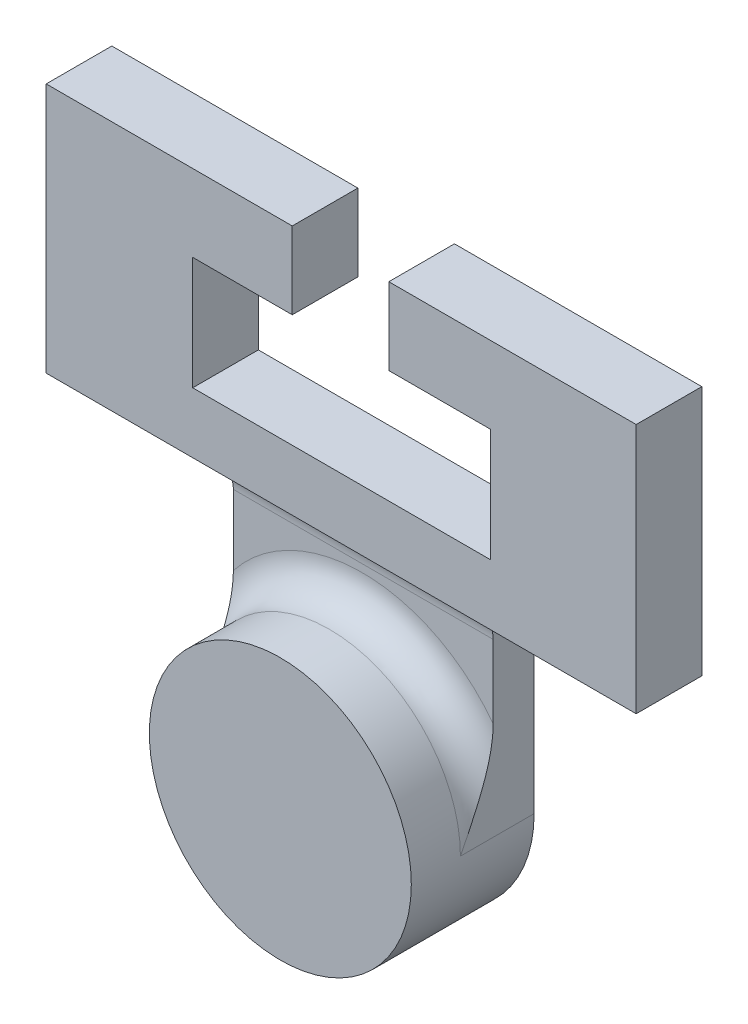
ISO-10303-21;
HEADER;
FILE_DESCRIPTION(('STEP AP214'),'2;1');
FILE_NAME('part.step','',(''),(''),'','','');
FILE_SCHEMA(('AUTOMOTIVE_DESIGN { 1 0 10303 214 1 1 1 1 }'));
ENDSEC;
DATA;
#1=APPLICATION_CONTEXT('core data for automotive mechanical design processes');
#2=APPLICATION_PROTOCOL_DEFINITION('international standard','automotive_design',2000,#1);
#3=PRODUCT_CONTEXT('',#1,'mechanical');
#4=PRODUCT('Part','Part','',(#3));
#5=PRODUCT_RELATED_PRODUCT_CATEGORY('part','',(#4));
#6=PRODUCT_DEFINITION_FORMATION('','',#4);
#7=PRODUCT_DEFINITION_CONTEXT('part definition',#1,'design');
#8=PRODUCT_DEFINITION('design','',#6,#7);
#9=PRODUCT_DEFINITION_SHAPE('','',#8);
#10=(LENGTH_UNIT() NAMED_UNIT(*) SI_UNIT(.MILLI.,.METRE.));
#11=(NAMED_UNIT(*) PLANE_ANGLE_UNIT() SI_UNIT($,.RADIAN.));
#12=(NAMED_UNIT(*) SI_UNIT($,.STERADIAN.) SOLID_ANGLE_UNIT());
#13=UNCERTAINTY_MEASURE_WITH_UNIT(LENGTH_MEASURE(1.E-05),#10,'distance_accuracy_value','');
#14=(GEOMETRIC_REPRESENTATION_CONTEXT(3) GLOBAL_UNCERTAINTY_ASSIGNED_CONTEXT((#13)) GLOBAL_UNIT_ASSIGNED_CONTEXT((#10,
#11,#12)) REPRESENTATION_CONTEXT('',''));
#15=CARTESIAN_POINT('',(0.,0.,0.));
#16=DIRECTION('',(0.,0.,1.));
#17=DIRECTION('',(1.,0.,0.));
#18=AXIS2_PLACEMENT_3D('',#15,#16,#17);
#19=CARTESIAN_POINT('',(0.,15.7544963007669,0.));
#20=DIRECTION('',(0.,1.,0.));
#21=DIRECTION('',(0.,0.,1.));
#22=AXIS2_PLACEMENT_3D('',#19,#20,#21);
#23=PLANE('',#22);
#24=DIRECTION('',(1.,0.,0.));
#25=VECTOR('',#24,1.);
#26=CARTESIAN_POINT('',(-22.5940298544979,15.7544963007669,-4.4350592362056));
#27=LINE('',#26,#25);
#28=CARTESIAN_POINT('',(10.16,15.7544963007669,-4.4350592362056));
#29=VERTEX_POINT('',#28);
#30=CARTESIAN_POINT('',(23.1661170587528,15.7544963007669,-4.4350592362056));
#31=VERTEX_POINT('',#30);
#32=EDGE_CURVE('E315',#29,#31,#27,.T.);
#33=ORIENTED_EDGE('',*,*,#32,.F.);
#34=DIRECTION('',(0.,0.,-1.));
#35=VECTOR('',#34,1.);
#36=CARTESIAN_POINT('',(10.16,15.7544963007669,-6.35));
#37=LINE('',#36,#35);
#38=CARTESIAN_POINT('',(10.16,15.7544963007669,-9.525));
#39=VERTEX_POINT('',#38);
#40=EDGE_CURVE('E276',#29,#39,#37,.T.);
#41=ORIENTED_EDGE('',*,*,#40,.T.);
#42=DIRECTION('',(-1.,0.,0.));
#43=VECTOR('',#42,1.);
#44=CARTESIAN_POINT('',(-9.99152441464391,15.7544963007669,-9.525));
#45=LINE('',#44,#43);
#46=CARTESIAN_POINT('',(23.1661170587528,15.7544963007669,-9.525));
#47=VERTEX_POINT('',#46);
#48=EDGE_CURVE('E335',#47,#39,#45,.T.);
#49=ORIENTED_EDGE('',*,*,#48,.F.);
#50=DIRECTION('',(0.,0.,-1.));
#51=VECTOR('',#50,1.);
#52=CARTESIAN_POINT('',(23.1661170587528,15.7544963007669,-4.4350592362056));
#53=LINE('',#52,#51);
#54=EDGE_CURVE('E309',#31,#47,#53,.T.);
#55=ORIENTED_EDGE('',*,*,#54,.F.);
#56=EDGE_LOOP('',(#33,#41,#49,#55));
#57=FACE_BOUND('',#56,.T.);
#58=ADVANCED_FACE('F49',(#57),#23,.F.);
#59=CARTESIAN_POINT('',(0.,0.,-9.525));
#60=DIRECTION('',(0.,0.,1.));
#61=DIRECTION('',(1.,0.,0.));
#62=AXIS2_PLACEMENT_3D('',#59,#60,#61);
#63=CYLINDRICAL_SURFACE('',#62,10.16);
#64=DIRECTION('',(0.,0.,-1.));
#65=VECTOR('',#64,1.);
#66=CARTESIAN_POINT('',(10.16,0.,-6.35));
#67=LINE('',#66,#65);
#68=CARTESIAN_POINT('',(10.16,0.,-3.81));
#69=VERTEX_POINT('',#68);
#70=CARTESIAN_POINT('',(10.16,0.,-9.525));
#71=VERTEX_POINT('',#70);
#72=EDGE_CURVE('E266',#69,#71,#67,.T.);
#73=ORIENTED_EDGE('',*,*,#72,.F.);
#74=CARTESIAN_POINT('',(0.,0.,-3.81));
#75=DIRECTION('',(0.,0.,1.));
#76=DIRECTION('',(1.,0.,0.));
#77=AXIS2_PLACEMENT_3D('',#74,#75,#76);
#78=CIRCLE('',#77,10.16);
#79=CARTESIAN_POINT('',(-9.99152441464391,1.84256339689434,-3.81));
#80=VERTEX_POINT('',#79);
#81=EDGE_CURVE('E451',#69,#80,#78,.T.);
#82=ORIENTED_EDGE('',*,*,#81,.T.);
#83=DIRECTION('',(0.,0.,1.));
#84=VECTOR('',#83,1.);
#85=CARTESIAN_POINT('',(-9.99152441464391,1.84256339689434,-9.525));
#86=LINE('',#85,#84);
#87=CARTESIAN_POINT('',(-9.99152441464391,1.84256339689432,-9.525));
#88=VERTEX_POINT('',#87);
#89=EDGE_CURVE('E281',#88,#80,#86,.T.);
#90=ORIENTED_EDGE('',*,*,#89,.F.);
#91=CARTESIAN_POINT('',(0.,0.,-9.525));
#92=DIRECTION('',(0.,0.,1.));
#93=DIRECTION('',(1.,0.,0.));
#94=AXIS2_PLACEMENT_3D('',#91,#92,#93);
#95=CIRCLE('',#94,10.16);
#96=EDGE_CURVE('E294',#88,#71,#95,.T.);
#97=ORIENTED_EDGE('',*,*,#96,.T.);
#98=EDGE_LOOP('',(#73,#82,#90,#97));
#99=FACE_BOUND('',#98,.T.);
#100=CARTESIAN_POINT('',(0.,0.,0.));
#101=DIRECTION('',(0.,0.,1.));
#102=DIRECTION('',(1.,0.,0.));
#103=AXIS2_PLACEMENT_3D('',#100,#101,#102);
#104=CIRCLE('',#103,10.16);
#105=CARTESIAN_POINT('',(10.16,0.,0.));
#106=VERTEX_POINT('',#105);
#107=EDGE_CURVE('E291',#106,#106,#104,.T.);
#108=ORIENTED_EDGE('',*,*,#107,.F.);
#109=EDGE_LOOP('',(#108));
#110=FACE_BOUND('',#109,.T.);
#111=ADVANCED_FACE('F434',(#99,#110),#63,.T.);
#112=CARTESIAN_POINT('',(0.,0.,-9.525));
#113=DIRECTION('',(0.,0.,1.));
#114=DIRECTION('',(1.,0.,0.));
#115=AXIS2_PLACEMENT_3D('',#112,#113,#114);
#116=PLANE('',#115);
#117=ORIENTED_EDGE('',*,*,#96,.F.);
#118=DIRECTION('',(0.,1.,0.));
#119=VECTOR('',#118,1.);
#120=CARTESIAN_POINT('',(-9.99152441464391,0.,-9.525));
#121=LINE('',#120,#119);
#122=CARTESIAN_POINT('',(-9.99152441464391,15.7544963007669,-9.525));
#123=VERTEX_POINT('',#122);
#124=EDGE_CURVE('E277',#88,#123,#121,.T.);
#125=ORIENTED_EDGE('',*,*,#124,.T.);
#126=CARTESIAN_POINT('',(-22.5940298544979,15.7544963007669,-9.525));
#127=VERTEX_POINT('',#126);
#128=EDGE_CURVE('E329',#123,#127,#45,.T.);
#129=ORIENTED_EDGE('',*,*,#128,.T.);
#130=DIRECTION('',(0.,-1.,0.));
#131=VECTOR('',#130,1.);
#132=CARTESIAN_POINT('',(-22.5940298544979,20.4534963007669,-9.525));
#133=LINE('',#132,#131);
#134=CARTESIAN_POINT('',(-22.5940298544979,35.1854963007669,-9.525));
#135=VERTEX_POINT('',#134);
#136=EDGE_CURVE('E186',#135,#127,#133,.T.);
#137=ORIENTED_EDGE('',*,*,#136,.F.);
#138=DIRECTION('',(-1.,0.,0.));
#139=VECTOR('',#138,1.);
#140=CARTESIAN_POINT('',(-22.5940298544979,35.1854963007669,-9.525));
#141=LINE('',#140,#139);
#142=CARTESIAN_POINT('',(-3.51021879319782,35.1854963007669,-9.525));
#143=VERTEX_POINT('',#142);
#144=EDGE_CURVE('E204',#143,#135,#141,.T.);
#145=ORIENTED_EDGE('',*,*,#144,.F.);
#146=DIRECTION('',(0.,-1.,0.));
#147=VECTOR('',#146,1.);
#148=CARTESIAN_POINT('',(-3.51021879319782,35.1854963007669,-9.525));
#149=LINE('',#148,#147);
#150=CARTESIAN_POINT('',(-3.51021879319782,29.2164963007669,-9.525));
#151=VERTEX_POINT('',#150);
#152=EDGE_CURVE('E220',#143,#151,#149,.T.);
#153=ORIENTED_EDGE('',*,*,#152,.T.);
#154=DIRECTION('',(-1.,0.,0.));
#155=VECTOR('',#154,1.);
#156=CARTESIAN_POINT('',(-22.5940298544979,29.2164963007669,-9.525));
#157=LINE('',#156,#155);
#158=CARTESIAN_POINT('',(-11.2292856636925,29.2164963007669,-9.525));
#159=VERTEX_POINT('',#158);
#160=EDGE_CURVE('E206',#151,#159,#157,.T.);
#161=ORIENTED_EDGE('',*,*,#160,.T.);
#162=DIRECTION('',(0.,-1.,0.));
#163=VECTOR('',#162,1.);
#164=CARTESIAN_POINT('',(-11.2292856636925,29.2164963007669,-9.525));
#165=LINE('',#164,#163);
#166=CARTESIAN_POINT('',(-11.2292856636925,20.4534963007669,-9.525));
#167=VERTEX_POINT('',#166);
#168=EDGE_CURVE('E362',#159,#167,#165,.T.);
#169=ORIENTED_EDGE('',*,*,#168,.T.);
#170=DIRECTION('',(-1.,0.,0.));
#171=VECTOR('',#170,1.);
#172=CARTESIAN_POINT('',(23.1661170587528,20.4534963007669,-9.525));
#173=LINE('',#172,#171);
#174=CARTESIAN_POINT('',(11.8519896998851,20.4534963007669,-9.525));
#175=VERTEX_POINT('',#174);
#176=EDGE_CURVE('E320',#175,#167,#173,.T.);
#177=ORIENTED_EDGE('',*,*,#176,.F.);
#178=DIRECTION('',(0.,-1.,0.));
#179=VECTOR('',#178,1.);
#180=CARTESIAN_POINT('',(11.8519896998851,29.2164963007669,-9.525));
#181=LINE('',#180,#179);
#182=CARTESIAN_POINT('',(11.8519896998851,29.2164963007669,-9.525));
#183=VERTEX_POINT('',#182);
#184=EDGE_CURVE('E229',#183,#175,#181,.T.);
#185=ORIENTED_EDGE('',*,*,#184,.F.);
#186=DIRECTION('',(-1.,0.,0.));
#187=VECTOR('',#186,1.);
#188=CARTESIAN_POINT('',(23.1661170587528,29.2164963007669,-9.525));
#189=LINE('',#188,#187);
#190=CARTESIAN_POINT('',(3.98107233357738,29.2164963007669,-9.525));
#191=VERTEX_POINT('',#190);
#192=EDGE_CURVE('E222',#183,#191,#189,.T.);
#193=ORIENTED_EDGE('',*,*,#192,.T.);
#194=DIRECTION('',(0.,-1.,0.));
#195=VECTOR('',#194,1.);
#196=CARTESIAN_POINT('',(3.98107233357738,35.1854963007669,-9.525));
#197=LINE('',#196,#195);
#198=CARTESIAN_POINT('',(3.98107233357738,35.1854963007669,-9.525));
#199=VERTEX_POINT('',#198);
#200=EDGE_CURVE('E227',#199,#191,#197,.T.);
#201=ORIENTED_EDGE('',*,*,#200,.F.);
#202=DIRECTION('',(-1.,0.,0.));
#203=VECTOR('',#202,1.);
#204=CARTESIAN_POINT('',(23.1661170587528,35.1854963007669,-9.525));
#205=LINE('',#204,#203);
#206=CARTESIAN_POINT('',(23.1661170587528,35.1854963007669,-9.525));
#207=VERTEX_POINT('',#206);
#208=EDGE_CURVE('E374',#207,#199,#205,.T.);
#209=ORIENTED_EDGE('',*,*,#208,.F.);
#210=DIRECTION('',(0.,-1.,0.));
#211=VECTOR('',#210,1.);
#212=CARTESIAN_POINT('',(23.1661170587528,20.4534963007669,-9.525));
#213=LINE('',#212,#211);
#214=EDGE_CURVE('E318',#207,#47,#213,.T.);
#215=ORIENTED_EDGE('',*,*,#214,.T.);
#216=ORIENTED_EDGE('',*,*,#48,.T.);
#217=DIRECTION('',(0.,-1.,0.));
#218=VECTOR('',#217,1.);
#219=CARTESIAN_POINT('',(10.16,0.,-9.525));
#220=LINE('',#219,#218);
#221=EDGE_CURVE('E267',#39,#71,#220,.T.);
#222=ORIENTED_EDGE('',*,*,#221,.T.);
#223=EDGE_LOOP('',(#117,#125,#129,#137,#145,#153,#161,#169,#177,#185,#193,#201,#209,#215,#216,#222));
#224=FACE_BOUND('',#223,.T.);
#225=ADVANCED_FACE('F435',(#224),#116,.F.);
#226=CARTESIAN_POINT('',(0.,0.,0.));
#227=DIRECTION('',(0.,0.,1.));
#228=DIRECTION('',(1.,0.,0.));
#229=AXIS2_PLACEMENT_3D('',#226,#227,#228);
#230=PLANE('',#229);
#231=ORIENTED_EDGE('',*,*,#107,.T.);
#232=EDGE_LOOP('',(#231));
#233=FACE_BOUND('',#232,.T.);
#234=ADVANCED_FACE('F431',(#233),#230,.T.);
#235=CARTESIAN_POINT('',(10.16,0.,-6.35));
#236=DIRECTION('',(1.,0.,0.));
#237=DIRECTION('',(0.,0.,-1.));
#238=AXIS2_PLACEMENT_3D('',#235,#236,#237);
#239=PLANE('',#238);
#240=ORIENTED_EDGE('',*,*,#221,.F.);
#241=ORIENTED_EDGE('',*,*,#40,.F.);
#242=CARTESIAN_POINT('',(10.16,13.2926065893391,-3.81));
#243=DIRECTION('',(1.,0.,0.));
#244=DIRECTION('',(0.,0.,-1.));
#245=AXIS2_PLACEMENT_3D('',#242,#243,#244);
#246=CIRCLE('',#245,2.54);
#247=CARTESIAN_POINT('',(10.16,13.2926065893391,-6.35));
#248=VERTEX_POINT('',#247);
#249=EDGE_CURVE('E56',#29,#248,#246,.F.);
#250=ORIENTED_EDGE('',*,*,#249,.T.);
#251=DIRECTION('',(0.,-1.,0.));
#252=VECTOR('',#251,1.);
#253=CARTESIAN_POINT('',(10.16,0.,-6.35));
#254=LINE('',#253,#252);
#255=CARTESIAN_POINT('',(10.16,7.62,-6.35));
#256=VERTEX_POINT('',#255);
#257=EDGE_CURVE('E270',#248,#256,#254,.T.);
#258=ORIENTED_EDGE('',*,*,#257,.T.);
#259=CARTESIAN_POINT('',(10.16,7.62,-6.35));
#260=CARTESIAN_POINT('',(10.16,7.48531515066392,-6.34998738549339));
#261=CARTESIAN_POINT('',(10.16,7.35067062177982,-6.34614433362632));
#262=CARTESIAN_POINT('',(10.16,7.08183206063732,-6.33149392471334));
#263=CARTESIAN_POINT('',(10.16,6.94763781547969,-6.3206905353365));
#264=CARTESIAN_POINT('',(10.16,6.68030920496207,-6.29285541165915));
#265=CARTESIAN_POINT('',(10.16,6.547172883357,-6.27584208485763));
#266=CARTESIAN_POINT('',(10.16,6.28173171403548,-6.2361830992997));
#267=CARTESIAN_POINT('',(10.16,6.14942699959302,-6.21353656022479));
#268=CARTESIAN_POINT('',(10.16,5.75744022457985,-6.13865075881821));
#269=CARTESIAN_POINT('',(10.16,5.49914595087492,-6.07906561940978));
#270=CARTESIAN_POINT('',(10.16,4.9866778493414,-5.94381397149523));
#271=CARTESIAN_POINT('',(10.16,4.73250776330905,-5.86813365195526));
#272=CARTESIAN_POINT('',(10.16,4.09447408165025,-5.66021776840484));
#273=CARTESIAN_POINT('',(10.16,3.71345575145994,-5.51929816365535));
#274=CARTESIAN_POINT('',(10.16,2.95998505951042,-5.21654930871913));
#275=CARTESIAN_POINT('',(10.16,2.58753385128791,-5.05471726192648));
#276=CARTESIAN_POINT('',(10.16,1.47645217652455,-4.54817844184918));
#277=CARTESIAN_POINT('',(10.16,0.747087599414854,-4.18354341672372));
#278=CARTESIAN_POINT('',(10.16,0.0120207088861088,-3.81601033970811));
#279=CARTESIAN_POINT('',(10.16,0.00601034734003663,-3.81300515875871));
#280=CARTESIAN_POINT('',(10.16,0.,-3.81));
#281=B_SPLINE_CURVE_WITH_KNOTS('',3,(#259,#260,#261,#262,#263,#264,#265,#266,#267,#268,#269,
#270,#271,#272,#273,#274,#275,#276,#277,#278,#279,#280),.UNSPECIFIED.,.F.,.F.,(4,2,2,2,2,2,2,2,
2,2,4),(0.,0.403941775402386,0.807653491422406,1.21017811631667,1.61276568446946,
2.40728510391765,3.20248905939678,4.42020965081925,5.63809325599656,8.08341455486778,
8.10357391993737),.UNSPECIFIED.);
#282=EDGE_CURVE('E412',#256,#69,#281,.T.);
#283=ORIENTED_EDGE('',*,*,#282,.T.);
#284=ORIENTED_EDGE('',*,*,#72,.T.);
#285=EDGE_LOOP('',(#240,#241,#250,#258,#283,#284));
#286=FACE_BOUND('',#285,.T.);
#287=ADVANCED_FACE('F396',(#286),#239,.T.);
#288=CARTESIAN_POINT('',(-9.99152441464391,0.,-6.35));
#289=DIRECTION('',(-1.,0.,0.));
#290=DIRECTION('',(0.,0.,1.));
#291=AXIS2_PLACEMENT_3D('',#288,#289,#290);
#292=PLANE('',#291);
#293=ORIENTED_EDGE('',*,*,#124,.F.);
#294=ORIENTED_EDGE('',*,*,#89,.T.);
#295=CARTESIAN_POINT('',(-9.99152441464391,1.84256339689434,-3.81));
#296=CARTESIAN_POINT('',(-9.99152441464391,1.8424541535014,-3.84002277001059));
#297=CARTESIAN_POINT('',(-9.99152441464391,1.84549545338577,-3.86987717529825));
#298=CARTESIAN_POINT('',(-9.99152441464391,1.85678298219177,-3.92807109386576));
#299=CARTESIAN_POINT('',(-9.99152441464391,1.86493763302521,-3.9564279357417));
#300=CARTESIAN_POINT('',(-9.99152441464391,1.88941741091581,-4.02228915508515));
#301=CARTESIAN_POINT('',(-9.99152441464391,1.90768885654938,-4.05904688256618));
#302=CARTESIAN_POINT('',(-9.99152441464391,1.94960856494291,-4.12961102227543));
#303=CARTESIAN_POINT('',(-9.99152441464391,1.97330102864746,-4.1633898209084));
#304=CARTESIAN_POINT('',(-9.99152441464391,2.03397782414861,-4.24085622840689));
#305=CARTESIAN_POINT('',(-9.99152441464391,2.072545407596,-4.28328018597718));
#306=CARTESIAN_POINT('',(-9.99152441464391,2.1535040677536,-4.36436043720737));
#307=CARTESIAN_POINT('',(-9.99152441464391,2.19590385499025,-4.40300770974189));
#308=CARTESIAN_POINT('',(-9.99152441464391,2.28333861908611,-4.47766551515141));
#309=CARTESIAN_POINT('',(-9.99152441464391,2.32838659819299,-4.51366067061064));
#310=CARTESIAN_POINT('',(-9.99152441464391,2.42008569684124,-4.58341184269001));
#311=CARTESIAN_POINT('',(-9.99152441464391,2.46673498334053,-4.61717029793561));
#312=CARTESIAN_POINT('',(-9.99152441464391,2.61073375758317,-4.71745493090725));
#313=CARTESIAN_POINT('',(-9.99152441464391,2.70998320006213,-4.78124563746716));
#314=CARTESIAN_POINT('',(-9.99152441464391,2.91151882388832,-4.90387224561832));
#315=CARTESIAN_POINT('',(-9.99152441464391,3.01380685437798,-4.96270504290685));
#316=CARTESIAN_POINT('',(-9.99152441464391,3.22075938747354,-5.07651912125594));
#317=CARTESIAN_POINT('',(-9.99152441464391,3.32542813378245,-5.13149267117613));
#318=CARTESIAN_POINT('',(-9.99152441464391,3.53651012487133,-5.23799123015613));
#319=CARTESIAN_POINT('',(-9.99152441464391,3.6429235853784,-5.28951580869927));
#320=CARTESIAN_POINT('',(-9.99152441464391,3.96398864000632,-5.4391233857646));
#321=CARTESIAN_POINT('',(-9.99152441464391,4.18087108775008,-5.53245970336203));
#322=CARTESIAN_POINT('',(-9.99152441464391,4.61936847081786,-5.70652491553394));
#323=CARTESIAN_POINT('',(-9.99152441464391,4.84097841218383,-5.78726643134826));
#324=CARTESIAN_POINT('',(-9.99152441464391,5.28916109148242,-5.93526350728379));
#325=CARTESIAN_POINT('',(-9.99152441464391,5.515742455341,-6.00249316391068));
#326=CARTESIAN_POINT('',(-9.99152441464391,5.97294196221452,-6.121380694361));
#327=CARTESIAN_POINT('',(-9.99152441464391,6.20355933226168,-6.17304151610089));
#328=CARTESIAN_POINT('',(-9.99152441464391,6.66717054083647,-6.25810196390566));
#329=CARTESIAN_POINT('',(-9.99152441464391,6.90014895556861,-6.29158295762819));
#330=CARTESIAN_POINT('',(-9.99152441464391,7.25132609900462,-6.32604077615286));
#331=CARTESIAN_POINT('',(-9.99152441464391,7.36877217517777,-6.33490025720308));
#332=CARTESIAN_POINT('',(-9.99152441464391,7.60400221836609,-6.34687724537841));
#333=CARTESIAN_POINT('',(-9.99152441464391,7.72178630599323,-6.34999235334623));
#334=CARTESIAN_POINT('',(-9.99152441464391,7.83960712482295,-6.35));
#335=B_SPLINE_CURVE_WITH_KNOTS('',3,(#295,#296,#297,#298,#299,#300,#301,#302,#303,#304,#305,
#306,#307,#308,#309,#310,#311,#312,#313,#314,#315,#316,#317,#318,#319,#320,#321,#322,#323,#324,
#325,#326,#327,#328,#329,#330,#331,#332,#333,#334),.UNSPECIFIED.,.F.,.F.,(4,2,2,2,2,2,2,2,2,2,2,
2,2,2,2,2,2,2,2,4),(0.,0.0896456732726146,0.177729966668581,0.300174692897662,0.423655803804338,
0.595221837632734,0.767188146118511,0.940083752090281,1.11278764163755,1.46648065172118,
1.82039349967972,2.17499621509288,2.5296431114446,3.23755411350122,3.94475109705057,
4.65329117556496,5.36169700953223,6.06690552666625,6.42012003341047,6.77348202803256),.UNSPECIFIED.);
#336=CARTESIAN_POINT('',(-9.99152441464391,7.83960712482295,-6.35));
#337=VERTEX_POINT('',#336);
#338=EDGE_CURVE('E405',#80,#337,#335,.T.);
#339=ORIENTED_EDGE('',*,*,#338,.T.);
#340=DIRECTION('',(0.,1.,0.));
#341=VECTOR('',#340,1.);
#342=CARTESIAN_POINT('',(-9.99152441464391,0.,-6.35));
#343=LINE('',#342,#341);
#344=CARTESIAN_POINT('',(-9.99152441464391,13.2926065893391,-6.35));
#345=VERTEX_POINT('',#344);
#346=EDGE_CURVE('E261',#337,#345,#343,.T.);
#347=ORIENTED_EDGE('',*,*,#346,.T.);
#348=CARTESIAN_POINT('',(-9.99152441464391,13.2926065893391,-3.81));
#349=DIRECTION('',(-1.,0.,0.));
#350=DIRECTION('',(0.,0.,1.));
#351=AXIS2_PLACEMENT_3D('',#348,#349,#350);
#352=CIRCLE('',#351,2.54);
#353=CARTESIAN_POINT('',(-9.99152441464391,15.7544963007669,-4.4350592362056));
#354=VERTEX_POINT('',#353);
#355=EDGE_CURVE('E12',#345,#354,#352,.F.);
#356=ORIENTED_EDGE('',*,*,#355,.T.);
#357=DIRECTION('',(0.,0.,-1.));
#358=VECTOR('',#357,1.);
#359=CARTESIAN_POINT('',(-9.99152441464391,15.7544963007669,-6.35));
#360=LINE('',#359,#358);
#361=EDGE_CURVE('E284',#354,#123,#360,.T.);
#362=ORIENTED_EDGE('',*,*,#361,.T.);
#363=EDGE_LOOP('',(#293,#294,#339,#347,#356,#362));
#364=FACE_BOUND('',#363,.T.);
#365=ADVANCED_FACE('F423',(#364),#292,.T.);
#366=CARTESIAN_POINT('',(0.,0.,-6.35));
#367=DIRECTION('',(0.,0.,1.));
#368=DIRECTION('',(1.,0.,0.));
#369=AXIS2_PLACEMENT_3D('',#366,#367,#368);
#370=PLANE('',#369);
#371=ORIENTED_EDGE('',*,*,#257,.F.);
#372=DIRECTION('',(1.,0.,0.));
#373=VECTOR('',#372,1.);
#374=CARTESIAN_POINT('',(-9.99152441464391,13.2926065893391,-6.35));
#375=LINE('',#374,#373);
#376=EDGE_CURVE('E75',#248,#345,#375,.F.);
#377=ORIENTED_EDGE('',*,*,#376,.T.);
#378=ORIENTED_EDGE('',*,*,#346,.F.);
#379=CARTESIAN_POINT('',(0.,0.,-6.35));
#380=DIRECTION('',(0.,0.,1.));
#381=DIRECTION('',(1.,0.,0.));
#382=AXIS2_PLACEMENT_3D('',#379,#380,#381);
#383=CIRCLE('',#382,12.7);
#384=EDGE_CURVE('E300',#337,#256,#383,.F.);
#385=ORIENTED_EDGE('',*,*,#384,.T.);
#386=EDGE_LOOP('',(#371,#377,#378,#385));
#387=FACE_BOUND('',#386,.T.);
#388=ADVANCED_FACE('F422',(#387),#370,.T.);
#389=CARTESIAN_POINT('',(-22.5940298544979,20.4534963007669,-9.525));
#390=DIRECTION('',(1.,0.,0.));
#391=DIRECTION('',(0.,0.,-1.));
#392=AXIS2_PLACEMENT_3D('',#389,#390,#391);
#393=PLANE('',#392);
#394=DIRECTION('',(0.,0.,1.));
#395=VECTOR('',#394,1.);
#396=CARTESIAN_POINT('',(-22.5940298544979,15.7544963007669,-9.525));
#397=LINE('',#396,#395);
#398=CARTESIAN_POINT('',(-22.5940298544979,15.7544963007669,-4.4350592362056));
#399=VERTEX_POINT('',#398);
#400=EDGE_CURVE('E181',#127,#399,#397,.T.);
#401=ORIENTED_EDGE('',*,*,#400,.T.);
#402=DIRECTION('',(0.,-1.,0.));
#403=VECTOR('',#402,1.);
#404=CARTESIAN_POINT('',(-22.5940298544979,20.4534963007669,-4.4350592362056));
#405=LINE('',#404,#403);
#406=CARTESIAN_POINT('',(-22.5940298544979,35.1854963007669,-4.4350592362056));
#407=VERTEX_POINT('',#406);
#408=EDGE_CURVE('E176',#407,#399,#405,.T.);
#409=ORIENTED_EDGE('',*,*,#408,.F.);
#410=DIRECTION('',(0.,0.,1.));
#411=VECTOR('',#410,1.);
#412=CARTESIAN_POINT('',(-22.5940298544979,35.1854963007669,-9.525));
#413=LINE('',#412,#411);
#414=EDGE_CURVE('E182',#135,#407,#413,.T.);
#415=ORIENTED_EDGE('',*,*,#414,.F.);
#416=ORIENTED_EDGE('',*,*,#136,.T.);
#417=EDGE_LOOP('',(#401,#409,#415,#416));
#418=FACE_BOUND('',#417,.T.);
#419=ADVANCED_FACE('F179',(#418),#393,.F.);
#420=CARTESIAN_POINT('',(-22.5940298544979,20.4534963007669,-4.4350592362056));
#421=DIRECTION('',(0.,0.,-1.));
#422=DIRECTION('',(-1.,0.,0.));
#423=AXIS2_PLACEMENT_3D('',#420,#421,#422);
#424=PLANE('',#423);
#425=EDGE_CURVE('E305',#399,#354,#27,.T.);
#426=ORIENTED_EDGE('',*,*,#425,.T.);
#427=EDGE_CURVE('E313',#354,#29,#27,.T.);
#428=ORIENTED_EDGE('',*,*,#427,.T.);
#429=ORIENTED_EDGE('',*,*,#32,.T.);
#430=DIRECTION('',(0.,-1.,0.));
#431=VECTOR('',#430,1.);
#432=CARTESIAN_POINT('',(23.1661170587528,20.4534963007669,-4.4350592362056));
#433=LINE('',#432,#431);
#434=CARTESIAN_POINT('',(23.1661170587528,35.1854963007669,-4.4350592362056));
#435=VERTEX_POINT('',#434);
#436=EDGE_CURVE('E189',#435,#31,#433,.T.);
#437=ORIENTED_EDGE('',*,*,#436,.F.);
#438=DIRECTION('',(1.,0.,0.));
#439=VECTOR('',#438,1.);
#440=CARTESIAN_POINT('',(23.1661170587528,35.1854963007669,-4.4350592362056));
#441=LINE('',#440,#439);
#442=CARTESIAN_POINT('',(3.98107233357738,35.1854963007669,-4.4350592362056));
#443=VERTEX_POINT('',#442);
#444=EDGE_CURVE('E236',#443,#435,#441,.T.);
#445=ORIENTED_EDGE('',*,*,#444,.F.);
#446=DIRECTION('',(0.,-1.,0.));
#447=VECTOR('',#446,1.);
#448=CARTESIAN_POINT('',(3.98107233357738,35.1854963007669,-4.4350592362056));
#449=LINE('',#448,#447);
#450=CARTESIAN_POINT('',(3.98107233357738,29.2164963007669,-4.4350592362056));
#451=VERTEX_POINT('',#450);
#452=EDGE_CURVE('E233',#443,#451,#449,.T.);
#453=ORIENTED_EDGE('',*,*,#452,.T.);
#454=DIRECTION('',(1.,0.,0.));
#455=VECTOR('',#454,1.);
#456=CARTESIAN_POINT('',(23.1661170587528,29.2164963007669,-4.4350592362056));
#457=LINE('',#456,#455);
#458=CARTESIAN_POINT('',(11.8519896998851,29.2164963007669,-4.4350592362056));
#459=VERTEX_POINT('',#458);
#460=EDGE_CURVE('E239',#451,#459,#457,.T.);
#461=ORIENTED_EDGE('',*,*,#460,.T.);
#462=DIRECTION('',(0.,-1.,0.));
#463=VECTOR('',#462,1.);
#464=CARTESIAN_POINT('',(11.8519896998851,29.2164963007669,-4.4350592362056));
#465=LINE('',#464,#463);
#466=CARTESIAN_POINT('',(11.8519896998851,20.4534963007669,-4.4350592362056));
#467=VERTEX_POINT('',#466);
#468=EDGE_CURVE('E346',#459,#467,#465,.T.);
#469=ORIENTED_EDGE('',*,*,#468,.T.);
#470=DIRECTION('',(1.,0.,0.));
#471=VECTOR('',#470,1.);
#472=CARTESIAN_POINT('',(-22.5940298544979,20.4534963007669,-4.4350592362056));
#473=LINE('',#472,#471);
#474=CARTESIAN_POINT('',(-11.2292856636925,20.4534963007669,-4.4350592362056));
#475=VERTEX_POINT('',#474);
#476=EDGE_CURVE('E325',#475,#467,#473,.T.);
#477=ORIENTED_EDGE('',*,*,#476,.F.);
#478=DIRECTION('',(0.,-1.,0.));
#479=VECTOR('',#478,1.);
#480=CARTESIAN_POINT('',(-11.2292856636925,29.2164963007669,-4.4350592362056));
#481=LINE('',#480,#479);
#482=CARTESIAN_POINT('',(-11.2292856636925,29.2164963007669,-4.4350592362056));
#483=VERTEX_POINT('',#482);
#484=EDGE_CURVE('E340',#483,#475,#481,.T.);
#485=ORIENTED_EDGE('',*,*,#484,.F.);
#486=DIRECTION('',(1.,0.,0.));
#487=VECTOR('',#486,1.);
#488=CARTESIAN_POINT('',(-22.5940298544979,29.2164963007669,-4.4350592362056));
#489=LINE('',#488,#487);
#490=CARTESIAN_POINT('',(-3.51021879319782,29.2164963007669,-4.4350592362056));
#491=VERTEX_POINT('',#490);
#492=EDGE_CURVE('E217',#483,#491,#489,.T.);
#493=ORIENTED_EDGE('',*,*,#492,.T.);
#494=DIRECTION('',(0.,-1.,0.));
#495=VECTOR('',#494,1.);
#496=CARTESIAN_POINT('',(-3.51021879319782,35.1854963007669,-4.4350592362056));
#497=LINE('',#496,#495);
#498=CARTESIAN_POINT('',(-3.51021879319782,35.1854963007669,-4.4350592362056));
#499=VERTEX_POINT('',#498);
#500=EDGE_CURVE('E195',#499,#491,#497,.T.);
#501=ORIENTED_EDGE('',*,*,#500,.F.);
#502=DIRECTION('',(1.,0.,0.));
#503=VECTOR('',#502,1.);
#504=CARTESIAN_POINT('',(-22.5940298544979,35.1854963007669,-4.4350592362056));
#505=LINE('',#504,#503);
#506=EDGE_CURVE('E192',#407,#499,#505,.T.);
#507=ORIENTED_EDGE('',*,*,#506,.F.);
#508=ORIENTED_EDGE('',*,*,#408,.T.);
#509=EDGE_LOOP('',(#426,#428,#429,#437,#445,#453,#461,#469,#477,#485,#493,#501,#507,#508));
#510=FACE_BOUND('',#509,.T.);
#511=ADVANCED_FACE('F194',(#510),#424,.F.);
#512=CARTESIAN_POINT('',(23.1661170587528,20.4534963007669,-4.4350592362056));
#513=DIRECTION('',(-1.,0.,0.));
#514=DIRECTION('',(0.,0.,1.));
#515=AXIS2_PLACEMENT_3D('',#512,#513,#514);
#516=PLANE('',#515);
#517=ORIENTED_EDGE('',*,*,#54,.T.);
#518=ORIENTED_EDGE('',*,*,#214,.F.);
#519=DIRECTION('',(0.,0.,-1.));
#520=VECTOR('',#519,1.);
#521=CARTESIAN_POINT('',(23.1661170587528,35.1854963007669,-9.525));
#522=LINE('',#521,#520);
#523=EDGE_CURVE('E244',#435,#207,#522,.T.);
#524=ORIENTED_EDGE('',*,*,#523,.F.);
#525=ORIENTED_EDGE('',*,*,#436,.T.);
#526=EDGE_LOOP('',(#517,#518,#524,#525));
#527=FACE_BOUND('',#526,.T.);
#528=ADVANCED_FACE('F394',(#527),#516,.F.);
#529=CARTESIAN_POINT('',(0.,20.4534963007669,0.));
#530=DIRECTION('',(0.,1.,0.));
#531=DIRECTION('',(0.,0.,1.));
#532=AXIS2_PLACEMENT_3D('',#529,#530,#531);
#533=PLANE('',#532);
#534=DIRECTION('',(0.,0.,-1.));
#535=VECTOR('',#534,1.);
#536=CARTESIAN_POINT('',(-11.2292856636925,20.4534963007669,-9.525));
#537=LINE('',#536,#535);
#538=EDGE_CURVE('E355',#475,#167,#537,.T.);
#539=ORIENTED_EDGE('',*,*,#538,.F.);
#540=ORIENTED_EDGE('',*,*,#476,.T.);
#541=DIRECTION('',(0.,0.,1.));
#542=VECTOR('',#541,1.);
#543=CARTESIAN_POINT('',(11.8519896998851,20.4534963007669,-9.525));
#544=LINE('',#543,#542);
#545=EDGE_CURVE('E350',#175,#467,#544,.T.);
#546=ORIENTED_EDGE('',*,*,#545,.F.);
#547=ORIENTED_EDGE('',*,*,#176,.T.);
#548=EDGE_LOOP('',(#539,#540,#546,#547));
#549=FACE_BOUND('',#548,.T.);
#550=ADVANCED_FACE('F475',(#549),#533,.T.);
#551=ORIENTED_EDGE('',*,*,#361,.F.);
#552=ORIENTED_EDGE('',*,*,#425,.F.);
#553=ORIENTED_EDGE('',*,*,#400,.F.);
#554=ORIENTED_EDGE('',*,*,#128,.F.);
#555=EDGE_LOOP('',(#551,#552,#553,#554));
#556=FACE_BOUND('',#555,.T.);
#557=ADVANCED_FACE('F328',(#556),#23,.F.);
#558=CARTESIAN_POINT('',(11.8519896998851,29.2164963007669,-9.525));
#559=DIRECTION('',(1.,0.,0.));
#560=DIRECTION('',(0.,0.,-1.));
#561=AXIS2_PLACEMENT_3D('',#558,#559,#560);
#562=PLANE('',#561);
#563=ORIENTED_EDGE('',*,*,#545,.T.);
#564=ORIENTED_EDGE('',*,*,#468,.F.);
#565=DIRECTION('',(0.,0.,1.));
#566=VECTOR('',#565,1.);
#567=CARTESIAN_POINT('',(11.8519896998851,29.2164963007669,-9.525));
#568=LINE('',#567,#566);
#569=EDGE_CURVE('E344',#183,#459,#568,.T.);
#570=ORIENTED_EDGE('',*,*,#569,.F.);
#571=ORIENTED_EDGE('',*,*,#184,.T.);
#572=EDGE_LOOP('',(#563,#564,#570,#571));
#573=FACE_BOUND('',#572,.T.);
#574=ADVANCED_FACE('F480',(#573),#562,.F.);
#575=CARTESIAN_POINT('',(-11.2292856636925,29.2164963007669,-9.525));
#576=DIRECTION('',(-1.,0.,0.));
#577=DIRECTION('',(0.,0.,1.));
#578=AXIS2_PLACEMENT_3D('',#575,#576,#577);
#579=PLANE('',#578);
#580=ORIENTED_EDGE('',*,*,#538,.T.);
#581=ORIENTED_EDGE('',*,*,#168,.F.);
#582=DIRECTION('',(0.,0.,-1.));
#583=VECTOR('',#582,1.);
#584=CARTESIAN_POINT('',(-11.2292856636925,29.2164963007669,-9.525));
#585=LINE('',#584,#583);
#586=EDGE_CURVE('E368',#483,#159,#585,.T.);
#587=ORIENTED_EDGE('',*,*,#586,.F.);
#588=ORIENTED_EDGE('',*,*,#484,.T.);
#589=EDGE_LOOP('',(#580,#581,#587,#588));
#590=FACE_BOUND('',#589,.T.);
#591=ADVANCED_FACE('F483',(#590),#579,.F.);
#592=CARTESIAN_POINT('',(0.,29.2164963007669,0.));
#593=DIRECTION('',(0.,1.,0.));
#594=DIRECTION('',(0.,0.,1.));
#595=AXIS2_PLACEMENT_3D('',#592,#593,#594);
#596=PLANE('',#595);
#597=ORIENTED_EDGE('',*,*,#492,.F.);
#598=ORIENTED_EDGE('',*,*,#586,.T.);
#599=ORIENTED_EDGE('',*,*,#160,.F.);
#600=DIRECTION('',(0.,0.,-1.));
#601=VECTOR('',#600,1.);
#602=CARTESIAN_POINT('',(-3.51021879319782,29.2164963007669,-9.525));
#603=LINE('',#602,#601);
#604=EDGE_CURVE('E209',#491,#151,#603,.T.);
#605=ORIENTED_EDGE('',*,*,#604,.F.);
#606=EDGE_LOOP('',(#597,#598,#599,#605));
#607=FACE_BOUND('',#606,.T.);
#608=ADVANCED_FACE('F490',(#607),#596,.F.);
#609=CARTESIAN_POINT('',(-3.51021879319782,35.1854963007669,-9.525));
#610=DIRECTION('',(-1.,0.,0.));
#611=DIRECTION('',(0.,0.,1.));
#612=AXIS2_PLACEMENT_3D('',#609,#610,#611);
#613=PLANE('',#612);
#614=ORIENTED_EDGE('',*,*,#604,.T.);
#615=ORIENTED_EDGE('',*,*,#152,.F.);
#616=DIRECTION('',(0.,0.,-1.));
#617=VECTOR('',#616,1.);
#618=CARTESIAN_POINT('',(-3.51021879319782,35.1854963007669,-9.525));
#619=LINE('',#618,#617);
#620=EDGE_CURVE('E200',#499,#143,#619,.T.);
#621=ORIENTED_EDGE('',*,*,#620,.F.);
#622=ORIENTED_EDGE('',*,*,#500,.T.);
#623=EDGE_LOOP('',(#614,#615,#621,#622));
#624=FACE_BOUND('',#623,.T.);
#625=ADVANCED_FACE('F497',(#624),#613,.F.);
#626=CARTESIAN_POINT('',(0.,35.1854963007669,0.));
#627=DIRECTION('',(0.,1.,0.));
#628=DIRECTION('',(0.,0.,1.));
#629=AXIS2_PLACEMENT_3D('',#626,#627,#628);
#630=PLANE('',#629);
#631=ORIENTED_EDGE('',*,*,#414,.T.);
#632=ORIENTED_EDGE('',*,*,#506,.T.);
#633=ORIENTED_EDGE('',*,*,#620,.T.);
#634=ORIENTED_EDGE('',*,*,#144,.T.);
#635=EDGE_LOOP('',(#631,#632,#633,#634));
#636=FACE_BOUND('',#635,.T.);
#637=ADVANCED_FACE('F205',(#636),#630,.T.);
#638=CARTESIAN_POINT('',(3.98107233357738,35.1854963007669,-9.525));
#639=DIRECTION('',(1.,0.,0.));
#640=DIRECTION('',(0.,0.,-1.));
#641=AXIS2_PLACEMENT_3D('',#638,#639,#640);
#642=PLANE('',#641);
#643=DIRECTION('',(0.,0.,1.));
#644=VECTOR('',#643,1.);
#645=CARTESIAN_POINT('',(3.98107233357738,29.2164963007669,-9.525));
#646=LINE('',#645,#644);
#647=EDGE_CURVE('E241',#191,#451,#646,.T.);
#648=ORIENTED_EDGE('',*,*,#647,.T.);
#649=ORIENTED_EDGE('',*,*,#452,.F.);
#650=DIRECTION('',(0.,0.,1.));
#651=VECTOR('',#650,1.);
#652=CARTESIAN_POINT('',(3.98107233357738,35.1854963007669,-9.525));
#653=LINE('',#652,#651);
#654=EDGE_CURVE('E251',#199,#443,#653,.T.);
#655=ORIENTED_EDGE('',*,*,#654,.F.);
#656=ORIENTED_EDGE('',*,*,#200,.T.);
#657=EDGE_LOOP('',(#648,#649,#655,#656));
#658=FACE_BOUND('',#657,.T.);
#659=ADVANCED_FACE('F390',(#658),#642,.F.);
#660=CARTESIAN_POINT('',(0.,35.1854963007669,0.));
#661=DIRECTION('',(0.,-1.,0.));
#662=DIRECTION('',(0.,0.,-1.));
#663=AXIS2_PLACEMENT_3D('',#660,#661,#662);
#664=PLANE('',#663);
#665=ORIENTED_EDGE('',*,*,#523,.T.);
#666=ORIENTED_EDGE('',*,*,#208,.T.);
#667=ORIENTED_EDGE('',*,*,#654,.T.);
#668=ORIENTED_EDGE('',*,*,#444,.T.);
#669=EDGE_LOOP('',(#665,#666,#667,#668));
#670=FACE_BOUND('',#669,.T.);
#671=ADVANCED_FACE('F382',(#670),#664,.F.);
#672=CARTESIAN_POINT('',(0.,29.2164963007669,0.));
#673=DIRECTION('',(0.,-1.,0.));
#674=DIRECTION('',(0.,0.,-1.));
#675=AXIS2_PLACEMENT_3D('',#672,#673,#674);
#676=PLANE('',#675);
#677=ORIENTED_EDGE('',*,*,#192,.F.);
#678=ORIENTED_EDGE('',*,*,#569,.T.);
#679=ORIENTED_EDGE('',*,*,#460,.F.);
#680=ORIENTED_EDGE('',*,*,#647,.F.);
#681=EDGE_LOOP('',(#677,#678,#679,#680));
#682=FACE_BOUND('',#681,.T.);
#683=ADVANCED_FACE('F491',(#682),#676,.T.);
#684=CARTESIAN_POINT('',(0.,0.,-3.81));
#685=DIRECTION('',(0.,0.,1.));
#686=DIRECTION('',(1.,0.,0.));
#687=AXIS2_PLACEMENT_3D('',#684,#685,#686);
#688=TOROIDAL_SURFACE('',#687,12.7,2.54);
#689=ORIENTED_EDGE('',*,*,#338,.F.);
#690=ORIENTED_EDGE('',*,*,#81,.F.);
#691=ORIENTED_EDGE('',*,*,#282,.F.);
#692=ORIENTED_EDGE('',*,*,#384,.F.);
#693=EDGE_LOOP('',(#689,#690,#691,#692));
#694=FACE_BOUND('',#693,.T.);
#695=ADVANCED_FACE('F416',(#694),#688,.F.);
#696=CARTESIAN_POINT('',(0.,13.2926065893391,-3.81));
#697=DIRECTION('',(-1.,0.,0.));
#698=DIRECTION('',(0.,0.,1.));
#699=AXIS2_PLACEMENT_3D('',#696,#697,#698);
#700=CYLINDRICAL_SURFACE('',#699,2.54);
#701=ORIENTED_EDGE('',*,*,#355,.F.);
#702=ORIENTED_EDGE('',*,*,#376,.F.);
#703=ORIENTED_EDGE('',*,*,#249,.F.);
#704=ORIENTED_EDGE('',*,*,#427,.F.);
#705=EDGE_LOOP('',(#701,#702,#703,#704));
#706=FACE_BOUND('',#705,.T.);
#707=ADVANCED_FACE('F55',(#706),#700,.F.);
#708=CLOSED_SHELL('',(#58,#111,#225,#234,#287,#365,#388,#419,#511,#528,#550,#557,#574,#591,#608,
#625,#637,#659,#671,#683,#695,#707));
#709=MANIFOLD_SOLID_BREP('B2',#708);
#710=ADVANCED_BREP_SHAPE_REPRESENTATION('',(#18,#709),#14);
#711=SHAPE_DEFINITION_REPRESENTATION(#9,#710);
ENDSEC;
END-ISO-10303-21;
